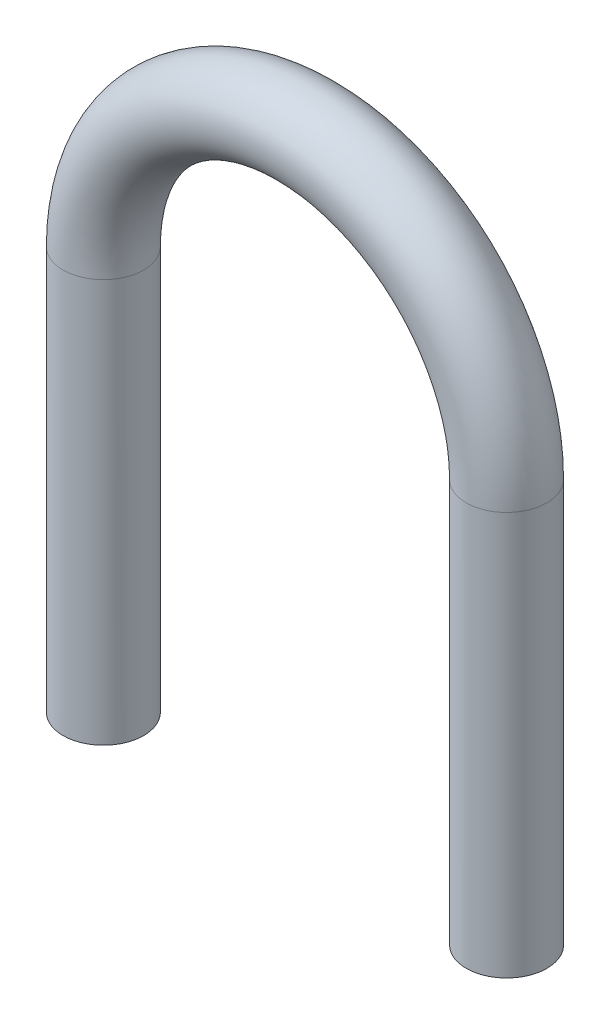
ISO-10303-21;
HEADER;
FILE_DESCRIPTION(('STEP AP214'),'2;1');
FILE_NAME('part.step','',(''),(''),'','','');
FILE_SCHEMA(('AUTOMOTIVE_DESIGN { 1 0 10303 214 1 1 1 1 }'));
ENDSEC;
DATA;
#1=APPLICATION_CONTEXT('core data for automotive mechanical design processes');
#2=APPLICATION_PROTOCOL_DEFINITION('international standard','automotive_design',2000,#1);
#3=PRODUCT_CONTEXT('',#1,'mechanical');
#4=PRODUCT('Part','Part','',(#3));
#5=PRODUCT_RELATED_PRODUCT_CATEGORY('part','',(#4));
#6=PRODUCT_DEFINITION_FORMATION('','',#4);
#7=PRODUCT_DEFINITION_CONTEXT('part definition',#1,'design');
#8=PRODUCT_DEFINITION('design','',#6,#7);
#9=PRODUCT_DEFINITION_SHAPE('','',#8);
#10=(LENGTH_UNIT() NAMED_UNIT(*) SI_UNIT(.MILLI.,.METRE.));
#11=(NAMED_UNIT(*) PLANE_ANGLE_UNIT() SI_UNIT($,.RADIAN.));
#12=(NAMED_UNIT(*) SI_UNIT($,.STERADIAN.) SOLID_ANGLE_UNIT());
#13=UNCERTAINTY_MEASURE_WITH_UNIT(LENGTH_MEASURE(1.E-05),#10,'distance_accuracy_value','');
#14=(GEOMETRIC_REPRESENTATION_CONTEXT(3) GLOBAL_UNCERTAINTY_ASSIGNED_CONTEXT((#13)) GLOBAL_UNIT_ASSIGNED_CONTEXT((#10,
#11,#12)) REPRESENTATION_CONTEXT('',''));
#15=CARTESIAN_POINT('',(0.,0.,0.));
#16=DIRECTION('',(0.,0.,1.));
#17=DIRECTION('',(1.,0.,0.));
#18=AXIS2_PLACEMENT_3D('',#15,#16,#17);
#19=CARTESIAN_POINT('',(0.,25.,0.));
#20=DIRECTION('',(0.,-1.,0.));
#21=DIRECTION('',(0.,0.,-1.));
#22=AXIS2_PLACEMENT_3D('',#19,#20,#21);
#23=CYLINDRICAL_SURFACE('',#22,2.5);
#24=CARTESIAN_POINT('',(0.,25.,0.));
#25=DIRECTION('',(0.,-1.,0.));
#26=DIRECTION('',(0.,0.,1.));
#27=AXIS2_PLACEMENT_3D('',#24,#25,#26);
#28=CIRCLE('',#27,2.5);
#29=CARTESIAN_POINT('',(-2.5,25.,0.));
#30=VERTEX_POINT('',#29);
#31=EDGE_CURVE('E36',#30,#30,#28,.T.);
#32=ORIENTED_EDGE('',*,*,#31,.T.);
#33=EDGE_LOOP('',(#32));
#34=FACE_BOUND('',#33,.T.);
#35=CARTESIAN_POINT('',(0.,0.,0.));
#36=DIRECTION('',(0.,-1.,0.));
#37=DIRECTION('',(0.,0.,1.));
#38=AXIS2_PLACEMENT_3D('',#35,#36,#37);
#39=CIRCLE('',#38,2.5);
#40=CARTESIAN_POINT('',(0.,0.,2.5));
#41=VERTEX_POINT('',#40);
#42=EDGE_CURVE('E10',#41,#41,#39,.T.);
#43=ORIENTED_EDGE('',*,*,#42,.F.);
#44=EDGE_LOOP('',(#43));
#45=FACE_BOUND('',#44,.T.);
#46=ADVANCED_FACE('F30',(#34,#45),#23,.T.);
#47=CARTESIAN_POINT('',(12.5,25.,0.));
#48=DIRECTION('',(0.,0.,1.));
#49=DIRECTION('',(1.,0.,0.));
#50=AXIS2_PLACEMENT_3D('',#47,#48,#49);
#51=TOROIDAL_SURFACE('',#50,12.5,2.5);
#52=CARTESIAN_POINT('',(25.,25.,0.));
#53=DIRECTION('',(0.,1.,0.));
#54=DIRECTION('',(0.,0.,1.));
#55=AXIS2_PLACEMENT_3D('',#52,#53,#54);
#56=CIRCLE('',#55,2.5);
#57=CARTESIAN_POINT('',(27.5,25.,0.));
#58=VERTEX_POINT('',#57);
#59=EDGE_CURVE('E40',#58,#58,#56,.T.);
#60=CARTESIAN_POINT('',(12.5,25.,0.));
#61=DIRECTION('',(0.,0.,1.));
#62=DIRECTION('',(1.,0.,0.));
#63=AXIS2_PLACEMENT_3D('',#60,#61,#62);
#64=CIRCLE('',#63,15.);
#65=EDGE_CURVE('',#58,#30,#64,.T.);
#66=ORIENTED_EDGE('',*,*,#59,.T.);
#67=ORIENTED_EDGE('',*,*,#31,.F.);
#68=ORIENTED_EDGE('',*,*,#65,.T.);
#69=ORIENTED_EDGE('',*,*,#65,.F.);
#70=EDGE_LOOP('',(#66,#68,#67,#69));
#71=FACE_BOUND('',#70,.T.);
#72=ADVANCED_FACE('F62',(#71),#51,.T.);
#73=CARTESIAN_POINT('',(25.,25.,0.));
#74=DIRECTION('',(0.,-1.,0.));
#75=DIRECTION('',(0.,0.,-1.));
#76=AXIS2_PLACEMENT_3D('',#73,#74,#75);
#77=CYLINDRICAL_SURFACE('',#76,2.5);
#78=ORIENTED_EDGE('',*,*,#59,.F.);
#79=EDGE_LOOP('',(#78));
#80=FACE_BOUND('',#79,.T.);
#81=CARTESIAN_POINT('',(25.,0.,0.));
#82=DIRECTION('',(0.,1.,0.));
#83=DIRECTION('',(0.,0.,1.));
#84=AXIS2_PLACEMENT_3D('',#81,#82,#83);
#85=CIRCLE('',#84,2.5);
#86=CARTESIAN_POINT('',(25.,0.,2.5));
#87=VERTEX_POINT('',#86);
#88=EDGE_CURVE('E44',#87,#87,#85,.T.);
#89=ORIENTED_EDGE('',*,*,#88,.T.);
#90=EDGE_LOOP('',(#89));
#91=FACE_BOUND('',#90,.T.);
#92=ADVANCED_FACE('F50',(#80,#91),#77,.T.);
#93=CARTESIAN_POINT('',(0.,0.,0.));
#94=DIRECTION('',(0.,-1.,0.));
#95=DIRECTION('',(0.,0.,1.));
#96=AXIS2_PLACEMENT_3D('',#93,#94,#95);
#97=PLANE('',#96);
#98=ORIENTED_EDGE('',*,*,#42,.T.);
#99=EDGE_LOOP('',(#98));
#100=FACE_BOUND('',#99,.T.);
#101=ADVANCED_FACE('F54',(#100),#97,.T.);
#102=CARTESIAN_POINT('',(25.,0.,0.));
#103=DIRECTION('',(0.,1.,0.));
#104=DIRECTION('',(0.,0.,1.));
#105=AXIS2_PLACEMENT_3D('',#102,#103,#104);
#106=PLANE('',#105);
#107=ORIENTED_EDGE('',*,*,#88,.F.);
#108=EDGE_LOOP('',(#107));
#109=FACE_BOUND('',#108,.T.);
#110=ADVANCED_FACE('F52',(#109),#106,.F.);
#111=CLOSED_SHELL('',(#46,#72,#92,#101,#110));
#112=MANIFOLD_SOLID_BREP('B2',#111);
#113=ADVANCED_BREP_SHAPE_REPRESENTATION('',(#18,#112),#14);
#114=SHAPE_DEFINITION_REPRESENTATION(#9,#113);
ENDSEC;
END-ISO-10303-21;
